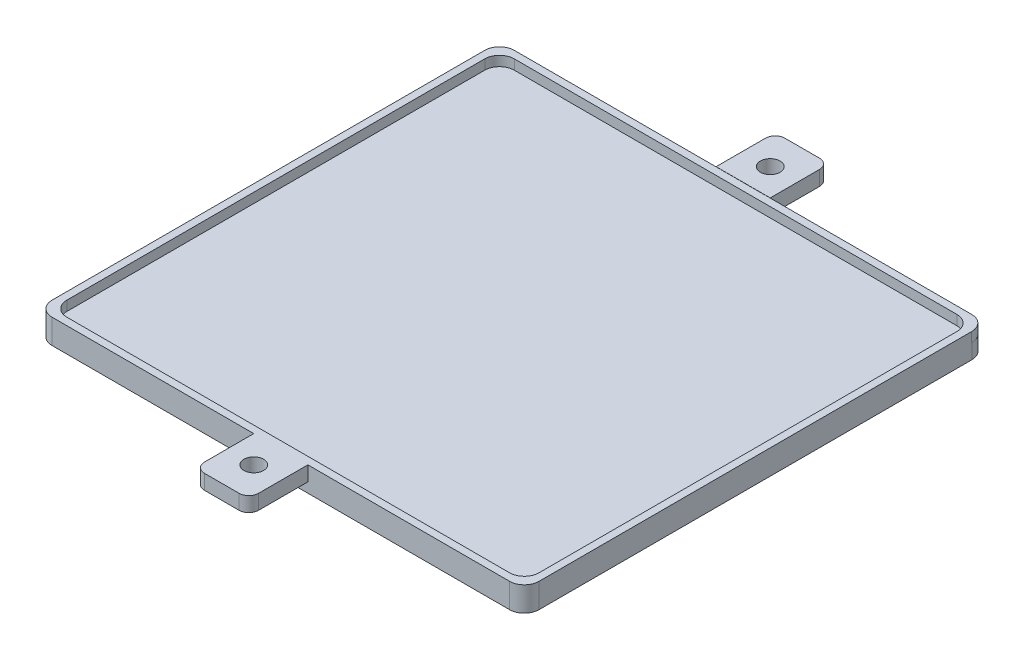
ISO-10303-21;
HEADER;
FILE_DESCRIPTION(('STEP AP214'),'2;1');
FILE_NAME('part.step','',(''),(''),'','','');
FILE_SCHEMA(('AUTOMOTIVE_DESIGN { 1 0 10303 214 1 1 1 1 }'));
ENDSEC;
DATA;
#1=APPLICATION_CONTEXT('core data for automotive mechanical design processes');
#2=APPLICATION_PROTOCOL_DEFINITION('international standard','automotive_design',2000,#1);
#3=PRODUCT_CONTEXT('',#1,'mechanical');
#4=PRODUCT('Part','Part','',(#3));
#5=PRODUCT_RELATED_PRODUCT_CATEGORY('part','',(#4));
#6=PRODUCT_DEFINITION_FORMATION('','',#4);
#7=PRODUCT_DEFINITION_CONTEXT('part definition',#1,'design');
#8=PRODUCT_DEFINITION('design','',#6,#7);
#9=PRODUCT_DEFINITION_SHAPE('','',#8);
#10=(LENGTH_UNIT() NAMED_UNIT(*) SI_UNIT(.MILLI.,.METRE.));
#11=(NAMED_UNIT(*) PLANE_ANGLE_UNIT() SI_UNIT($,.RADIAN.));
#12=(NAMED_UNIT(*) SI_UNIT($,.STERADIAN.) SOLID_ANGLE_UNIT());
#13=UNCERTAINTY_MEASURE_WITH_UNIT(LENGTH_MEASURE(1.E-05),#10,'distance_accuracy_value','');
#14=(GEOMETRIC_REPRESENTATION_CONTEXT(3) GLOBAL_UNCERTAINTY_ASSIGNED_CONTEXT((#13)) GLOBAL_UNIT_ASSIGNED_CONTEXT((#10,
#11,#12)) REPRESENTATION_CONTEXT('',''));
#15=CARTESIAN_POINT('',(0.,0.,0.));
#16=DIRECTION('',(0.,0.,1.));
#17=DIRECTION('',(1.,0.,0.));
#18=AXIS2_PLACEMENT_3D('',#15,#16,#17);
#19=CARTESIAN_POINT('',(0.,3.,0.));
#20=DIRECTION('',(0.,1.,0.));
#21=DIRECTION('',(0.,0.,1.));
#22=AXIS2_PLACEMENT_3D('',#19,#20,#21);
#23=PLANE('',#22);
#24=DIRECTION('',(-1.,0.,0.));
#25=VECTOR('',#24,1.);
#26=CARTESIAN_POINT('',(0.,3.,-90.9604451310085));
#27=LINE('',#26,#25);
#28=CARTESIAN_POINT('',(93.,3.,-90.9604451310085));
#29=VERTEX_POINT('',#28);
#30=CARTESIAN_POINT('',(0.,3.,-90.9604451310085));
#31=VERTEX_POINT('',#30);
#32=EDGE_CURVE('E61',#29,#31,#27,.T.);
#33=ORIENTED_EDGE('',*,*,#32,.F.);
#34=CARTESIAN_POINT('',(93.,3.,-87.9604451310085));
#35=DIRECTION('',(0.,1.,0.));
#36=DIRECTION('',(0.,0.,-1.));
#37=AXIS2_PLACEMENT_3D('',#34,#35,#36);
#38=CIRCLE('',#37,3.00000000000001);
#39=CARTESIAN_POINT('',(96.,3.,-87.9604451310085));
#40=VERTEX_POINT('',#39);
#41=EDGE_CURVE('E280',#40,#29,#38,.T.);
#42=ORIENTED_EDGE('',*,*,#41,.F.);
#43=DIRECTION('',(0.,0.,-1.));
#44=VECTOR('',#43,1.);
#45=CARTESIAN_POINT('',(96.,3.,0.));
#46=LINE('',#45,#44);
#47=CARTESIAN_POINT('',(96.,3.,-88.));
#48=VERTEX_POINT('',#47);
#49=EDGE_CURVE('E550',#40,#48,#46,.T.);
#50=ORIENTED_EDGE('',*,*,#49,.T.);
#51=CARTESIAN_POINT('',(93.,3.,-88.));
#52=DIRECTION('',(0.,1.,0.));
#53=DIRECTION('',(0.,0.,1.));
#54=AXIS2_PLACEMENT_3D('',#51,#52,#53);
#55=CIRCLE('',#54,3.);
#56=CARTESIAN_POINT('',(93.,3.,-91.));
#57=VERTEX_POINT('',#56);
#58=EDGE_CURVE('E553',#57,#48,#55,.F.);
#59=ORIENTED_EDGE('',*,*,#58,.F.);
#60=DIRECTION('',(1.,0.,0.));
#61=VECTOR('',#60,1.);
#62=CARTESIAN_POINT('',(0.,3.,-91.));
#63=LINE('',#62,#61);
#64=CARTESIAN_POINT('',(52.,3.,-91.));
#65=VERTEX_POINT('',#64);
#66=EDGE_CURVE('E558',#65,#57,#63,.T.);
#67=ORIENTED_EDGE('',*,*,#66,.F.);
#68=CARTESIAN_POINT('',(41.,3.,-91.));
#69=VERTEX_POINT('',#68);
#70=EDGE_CURVE('E564',#69,#65,#63,.T.);
#71=ORIENTED_EDGE('',*,*,#70,.F.);
#72=CARTESIAN_POINT('',(0.,3.,-91.));
#73=VERTEX_POINT('',#72);
#74=EDGE_CURVE('E559',#73,#69,#63,.T.);
#75=ORIENTED_EDGE('',*,*,#74,.F.);
#76=CARTESIAN_POINT('',(0.,3.,-88.));
#77=DIRECTION('',(0.,1.,0.));
#78=DIRECTION('',(0.,0.,1.));
#79=AXIS2_PLACEMENT_3D('',#76,#77,#78);
#80=CIRCLE('',#79,3.);
#81=CARTESIAN_POINT('',(-3.,3.,-88.));
#82=VERTEX_POINT('',#81);
#83=EDGE_CURVE('E563',#82,#73,#80,.F.);
#84=ORIENTED_EDGE('',*,*,#83,.F.);
#85=DIRECTION('',(0.,0.,-1.));
#86=VECTOR('',#85,1.);
#87=CARTESIAN_POINT('',(-3.,3.,0.));
#88=LINE('',#87,#86);
#89=CARTESIAN_POINT('',(-3.,3.,-87.9604451310085));
#90=VERTEX_POINT('',#89);
#91=EDGE_CURVE('E568',#90,#82,#88,.T.);
#92=ORIENTED_EDGE('',*,*,#91,.F.);
#93=CARTESIAN_POINT('',(0.,3.,-87.9604451310085));
#94=DIRECTION('',(0.,1.,0.));
#95=DIRECTION('',(0.,0.,1.));
#96=AXIS2_PLACEMENT_3D('',#93,#94,#95);
#97=CIRCLE('',#96,3.);
#98=EDGE_CURVE('E66',#31,#90,#97,.T.);
#99=ORIENTED_EDGE('',*,*,#98,.F.);
#100=EDGE_LOOP('',(#33,#42,#50,#59,#67,#71,#75,#84,#92,#99));
#101=FACE_BOUND('',#100,.T.);
#102=ADVANCED_FACE('F45',(#101),#23,.T.);
#103=CARTESIAN_POINT('',(0.,3.,3.));
#104=DIRECTION('',(0.,0.,-1.));
#105=DIRECTION('',(-1.,0.,0.));
#106=AXIS2_PLACEMENT_3D('',#103,#104,#105);
#107=PLANE('',#106);
#108=DIRECTION('',(1.,0.,0.));
#109=VECTOR('',#108,1.);
#110=CARTESIAN_POINT('',(0.,2.,3.));
#111=LINE('',#110,#109);
#112=CARTESIAN_POINT('',(41.,2.,3.));
#113=VERTEX_POINT('',#112);
#114=CARTESIAN_POINT('',(52.,2.,3.));
#115=VERTEX_POINT('',#114);
#116=EDGE_CURVE('E486',#113,#115,#111,.T.);
#117=ORIENTED_EDGE('',*,*,#116,.F.);
#118=DIRECTION('',(0.,-1.,0.));
#119=VECTOR('',#118,1.);
#120=CARTESIAN_POINT('',(41.,5.,3.));
#121=LINE('',#120,#119);
#122=CARTESIAN_POINT('',(41.,5.,3.));
#123=VERTEX_POINT('',#122);
#124=EDGE_CURVE('E503',#123,#113,#121,.T.);
#125=ORIENTED_EDGE('',*,*,#124,.F.);
#126=DIRECTION('',(1.,0.,0.));
#127=VECTOR('',#126,1.);
#128=CARTESIAN_POINT('',(0.,5.,3.));
#129=LINE('',#128,#127);
#130=CARTESIAN_POINT('',(0.,5.,3.));
#131=VERTEX_POINT('',#130);
#132=EDGE_CURVE('E359',#131,#123,#129,.T.);
#133=ORIENTED_EDGE('',*,*,#132,.F.);
#134=DIRECTION('',(0.,-1.,0.));
#135=VECTOR('',#134,1.);
#136=CARTESIAN_POINT('',(0.,3.,3.));
#137=LINE('',#136,#135);
#138=CARTESIAN_POINT('',(0.,0.,3.));
#139=VERTEX_POINT('',#138);
#140=EDGE_CURVE('E11',#131,#139,#137,.T.);
#141=ORIENTED_EDGE('',*,*,#140,.T.);
#142=DIRECTION('',(1.,0.,0.));
#143=VECTOR('',#142,1.);
#144=CARTESIAN_POINT('',(0.,0.,3.));
#145=LINE('',#144,#143);
#146=CARTESIAN_POINT('',(93.,0.,3.));
#147=VERTEX_POINT('',#146);
#148=EDGE_CURVE('E575',#139,#147,#145,.T.);
#149=ORIENTED_EDGE('',*,*,#148,.T.);
#150=DIRECTION('',(0.,-1.,0.));
#151=VECTOR('',#150,1.);
#152=CARTESIAN_POINT('',(93.,3.,3.));
#153=LINE('',#152,#151);
#154=CARTESIAN_POINT('',(93.,5.,3.));
#155=VERTEX_POINT('',#154);
#156=EDGE_CURVE('E54',#155,#147,#153,.T.);
#157=ORIENTED_EDGE('',*,*,#156,.F.);
#158=CARTESIAN_POINT('',(52.,5.,3.));
#159=VERTEX_POINT('',#158);
#160=EDGE_CURVE('E358',#159,#155,#129,.T.);
#161=ORIENTED_EDGE('',*,*,#160,.F.);
#162=DIRECTION('',(0.,-1.,0.));
#163=VECTOR('',#162,1.);
#164=CARTESIAN_POINT('',(52.,5.,3.));
#165=LINE('',#164,#163);
#166=EDGE_CURVE('E530',#159,#115,#165,.T.);
#167=ORIENTED_EDGE('',*,*,#166,.T.);
#168=EDGE_LOOP('',(#117,#125,#133,#141,#149,#157,#161,#167));
#169=FACE_BOUND('',#168,.T.);
#170=ADVANCED_FACE('F696',(#169),#107,.F.);
#171=CARTESIAN_POINT('',(0.,3.,0.));
#172=DIRECTION('',(0.,-1.,0.));
#173=DIRECTION('',(0.,0.,-1.));
#174=AXIS2_PLACEMENT_3D('',#171,#172,#173);
#175=CYLINDRICAL_SURFACE('',#174,3.);
#176=CARTESIAN_POINT('',(0.,0.,0.));
#177=DIRECTION('',(0.,1.,0.));
#178=DIRECTION('',(0.,0.,1.));
#179=AXIS2_PLACEMENT_3D('',#176,#177,#178);
#180=CIRCLE('',#179,3.);
#181=CARTESIAN_POINT('',(-3.,0.,0.));
#182=VERTEX_POINT('',#181);
#183=EDGE_CURVE('E549',#139,#182,#180,.F.);
#184=ORIENTED_EDGE('',*,*,#183,.F.);
#185=ORIENTED_EDGE('',*,*,#140,.F.);
#186=CARTESIAN_POINT('',(0.,5.,0.));
#187=DIRECTION('',(0.,1.,0.));
#188=DIRECTION('',(0.,0.,1.));
#189=AXIS2_PLACEMENT_3D('',#186,#187,#188);
#190=CIRCLE('',#189,3.);
#191=CARTESIAN_POINT('',(-3.,5.,0.));
#192=VERTEX_POINT('',#191);
#193=EDGE_CURVE('E354',#192,#131,#190,.T.);
#194=ORIENTED_EDGE('',*,*,#193,.F.);
#195=DIRECTION('',(0.,-1.,0.));
#196=VECTOR('',#195,1.);
#197=CARTESIAN_POINT('',(-3.,3.,0.));
#198=LINE('',#197,#196);
#199=EDGE_CURVE('E571',#192,#182,#198,.T.);
#200=ORIENTED_EDGE('',*,*,#199,.T.);
#201=EDGE_LOOP('',(#184,#185,#194,#200));
#202=FACE_BOUND('',#201,.T.);
#203=ADVANCED_FACE('F47',(#202),#175,.T.);
#204=CARTESIAN_POINT('',(93.,3.,0.));
#205=DIRECTION('',(0.,-1.,0.));
#206=DIRECTION('',(0.,0.,-1.));
#207=AXIS2_PLACEMENT_3D('',#204,#205,#206);
#208=CYLINDRICAL_SURFACE('',#207,3.);
#209=CARTESIAN_POINT('',(93.,0.,0.));
#210=DIRECTION('',(0.,1.,0.));
#211=DIRECTION('',(0.,0.,1.));
#212=AXIS2_PLACEMENT_3D('',#209,#210,#211);
#213=CIRCLE('',#212,3.);
#214=CARTESIAN_POINT('',(96.,0.,0.));
#215=VERTEX_POINT('',#214);
#216=EDGE_CURVE('E578',#147,#215,#213,.T.);
#217=ORIENTED_EDGE('',*,*,#216,.T.);
#218=DIRECTION('',(0.,-1.,0.));
#219=VECTOR('',#218,1.);
#220=CARTESIAN_POINT('',(96.,3.,0.));
#221=LINE('',#220,#219);
#222=CARTESIAN_POINT('',(96.,5.,0.));
#223=VERTEX_POINT('',#222);
#224=EDGE_CURVE('E614',#223,#215,#221,.T.);
#225=ORIENTED_EDGE('',*,*,#224,.F.);
#226=CARTESIAN_POINT('',(93.,5.,0.));
#227=DIRECTION('',(0.,1.,0.));
#228=DIRECTION('',(0.,0.,1.));
#229=AXIS2_PLACEMENT_3D('',#226,#227,#228);
#230=CIRCLE('',#229,3.);
#231=EDGE_CURVE('E363',#155,#223,#230,.T.);
#232=ORIENTED_EDGE('',*,*,#231,.F.);
#233=ORIENTED_EDGE('',*,*,#156,.T.);
#234=EDGE_LOOP('',(#217,#225,#232,#233));
#235=FACE_BOUND('',#234,.T.);
#236=ADVANCED_FACE('F622',(#235),#208,.T.);
#237=CARTESIAN_POINT('',(96.,3.,0.));
#238=DIRECTION('',(-1.,0.,0.));
#239=DIRECTION('',(0.,0.,1.));
#240=AXIS2_PLACEMENT_3D('',#237,#238,#239);
#241=PLANE('',#240);
#242=DIRECTION('',(0.,0.,-1.));
#243=VECTOR('',#242,1.);
#244=CARTESIAN_POINT('',(96.,0.,0.));
#245=LINE('',#244,#243);
#246=CARTESIAN_POINT('',(96.,0.,-88.));
#247=VERTEX_POINT('',#246);
#248=EDGE_CURVE('E581',#215,#247,#245,.T.);
#249=ORIENTED_EDGE('',*,*,#248,.T.);
#250=DIRECTION('',(0.,-1.,0.));
#251=VECTOR('',#250,1.);
#252=CARTESIAN_POINT('',(96.,3.,-88.));
#253=LINE('',#252,#251);
#254=EDGE_CURVE('E611',#48,#247,#253,.T.);
#255=ORIENTED_EDGE('',*,*,#254,.F.);
#256=ORIENTED_EDGE('',*,*,#49,.F.);
#257=DIRECTION('',(0.,-1.,0.));
#258=VECTOR('',#257,1.);
#259=CARTESIAN_POINT('',(96.,5.,-87.9604451310085));
#260=LINE('',#259,#258);
#261=CARTESIAN_POINT('',(96.,5.,-87.9604451310085));
#262=VERTEX_POINT('',#261);
#263=EDGE_CURVE('E401',#262,#40,#260,.T.);
#264=ORIENTED_EDGE('',*,*,#263,.F.);
#265=DIRECTION('',(0.,0.,-1.));
#266=VECTOR('',#265,1.);
#267=CARTESIAN_POINT('',(96.,5.,-87.9604451310085));
#268=LINE('',#267,#266);
#269=EDGE_CURVE('E367',#223,#262,#268,.T.);
#270=ORIENTED_EDGE('',*,*,#269,.F.);
#271=ORIENTED_EDGE('',*,*,#224,.T.);
#272=EDGE_LOOP('',(#249,#255,#256,#264,#270,#271));
#273=FACE_BOUND('',#272,.T.);
#274=ADVANCED_FACE('F634',(#273),#241,.F.);
#275=CARTESIAN_POINT('',(93.,3.,-88.));
#276=DIRECTION('',(0.,-1.,0.));
#277=DIRECTION('',(0.,0.,-1.));
#278=AXIS2_PLACEMENT_3D('',#275,#276,#277);
#279=CYLINDRICAL_SURFACE('',#278,3.);
#280=CARTESIAN_POINT('',(93.,0.,-88.));
#281=DIRECTION('',(0.,1.,0.));
#282=DIRECTION('',(0.,0.,1.));
#283=AXIS2_PLACEMENT_3D('',#280,#281,#282);
#284=CIRCLE('',#283,3.);
#285=CARTESIAN_POINT('',(93.,0.,-91.));
#286=VERTEX_POINT('',#285);
#287=EDGE_CURVE('E585',#286,#247,#284,.F.);
#288=ORIENTED_EDGE('',*,*,#287,.F.);
#289=DIRECTION('',(0.,-1.,0.));
#290=VECTOR('',#289,1.);
#291=CARTESIAN_POINT('',(93.,3.,-91.));
#292=LINE('',#291,#290);
#293=EDGE_CURVE('E608',#57,#286,#292,.T.);
#294=ORIENTED_EDGE('',*,*,#293,.F.);
#295=ORIENTED_EDGE('',*,*,#58,.T.);
#296=ORIENTED_EDGE('',*,*,#254,.T.);
#297=EDGE_LOOP('',(#288,#294,#295,#296));
#298=FACE_BOUND('',#297,.T.);
#299=ADVANCED_FACE('F1071',(#298),#279,.T.);
#300=CARTESIAN_POINT('',(0.,3.,-91.));
#301=DIRECTION('',(0.,0.,-1.));
#302=DIRECTION('',(-1.,0.,0.));
#303=AXIS2_PLACEMENT_3D('',#300,#301,#302);
#304=PLANE('',#303);
#305=DIRECTION('',(0.,-1.,0.));
#306=VECTOR('',#305,1.);
#307=CARTESIAN_POINT('',(41.,5.,-91.));
#308=LINE('',#307,#306);
#309=CARTESIAN_POINT('',(41.,2.,-91.));
#310=VERTEX_POINT('',#309);
#311=EDGE_CURVE('E472',#69,#310,#308,.T.);
#312=ORIENTED_EDGE('',*,*,#311,.T.);
#313=DIRECTION('',(1.,0.,0.));
#314=VECTOR('',#313,1.);
#315=CARTESIAN_POINT('',(0.,2.,-91.));
#316=LINE('',#315,#314);
#317=CARTESIAN_POINT('',(52.,2.,-91.));
#318=VERTEX_POINT('',#317);
#319=EDGE_CURVE('E441',#310,#318,#316,.T.);
#320=ORIENTED_EDGE('',*,*,#319,.T.);
#321=DIRECTION('',(0.,-1.,0.));
#322=VECTOR('',#321,1.);
#323=CARTESIAN_POINT('',(52.,5.,-91.));
#324=LINE('',#323,#322);
#325=EDGE_CURVE('E467',#65,#318,#324,.T.);
#326=ORIENTED_EDGE('',*,*,#325,.F.);
#327=ORIENTED_EDGE('',*,*,#66,.T.);
#328=ORIENTED_EDGE('',*,*,#293,.T.);
#329=DIRECTION('',(1.,0.,0.));
#330=VECTOR('',#329,1.);
#331=CARTESIAN_POINT('',(0.,0.,-91.));
#332=LINE('',#331,#330);
#333=CARTESIAN_POINT('',(0.,0.,-91.));
#334=VERTEX_POINT('',#333);
#335=EDGE_CURVE('E589',#334,#286,#332,.T.);
#336=ORIENTED_EDGE('',*,*,#335,.F.);
#337=DIRECTION('',(0.,-1.,0.));
#338=VECTOR('',#337,1.);
#339=CARTESIAN_POINT('',(0.,3.,-91.));
#340=LINE('',#339,#338);
#341=EDGE_CURVE('E605',#73,#334,#340,.T.);
#342=ORIENTED_EDGE('',*,*,#341,.F.);
#343=ORIENTED_EDGE('',*,*,#74,.T.);
#344=EDGE_LOOP('',(#312,#320,#326,#327,#328,#336,#342,#343));
#345=FACE_BOUND('',#344,.T.);
#346=ADVANCED_FACE('F672',(#345),#304,.T.);
#347=CARTESIAN_POINT('',(0.,3.,-88.));
#348=DIRECTION('',(0.,-1.,0.));
#349=DIRECTION('',(0.,0.,-1.));
#350=AXIS2_PLACEMENT_3D('',#347,#348,#349);
#351=CYLINDRICAL_SURFACE('',#350,3.);
#352=CARTESIAN_POINT('',(0.,0.,-88.));
#353=DIRECTION('',(0.,1.,0.));
#354=DIRECTION('',(0.,0.,1.));
#355=AXIS2_PLACEMENT_3D('',#352,#353,#354);
#356=CIRCLE('',#355,3.);
#357=CARTESIAN_POINT('',(-3.,0.,-88.));
#358=VERTEX_POINT('',#357);
#359=EDGE_CURVE('E593',#358,#334,#356,.F.);
#360=ORIENTED_EDGE('',*,*,#359,.F.);
#361=DIRECTION('',(0.,-1.,0.));
#362=VECTOR('',#361,1.);
#363=CARTESIAN_POINT('',(-3.,3.,-88.));
#364=LINE('',#363,#362);
#365=EDGE_CURVE('E602',#82,#358,#364,.T.);
#366=ORIENTED_EDGE('',*,*,#365,.F.);
#367=ORIENTED_EDGE('',*,*,#83,.T.);
#368=ORIENTED_EDGE('',*,*,#341,.T.);
#369=EDGE_LOOP('',(#360,#366,#367,#368));
#370=FACE_BOUND('',#369,.T.);
#371=ADVANCED_FACE('F1080',(#370),#351,.T.);
#372=CARTESIAN_POINT('',(-3.,3.,0.));
#373=DIRECTION('',(-1.,0.,0.));
#374=DIRECTION('',(0.,0.,1.));
#375=AXIS2_PLACEMENT_3D('',#372,#373,#374);
#376=PLANE('',#375);
#377=DIRECTION('',(0.,0.,-1.));
#378=VECTOR('',#377,1.);
#379=CARTESIAN_POINT('',(-3.,0.,0.));
#380=LINE('',#379,#378);
#381=EDGE_CURVE('E554',#182,#358,#380,.T.);
#382=ORIENTED_EDGE('',*,*,#381,.F.);
#383=ORIENTED_EDGE('',*,*,#199,.F.);
#384=DIRECTION('',(0.,0.,1.));
#385=VECTOR('',#384,1.);
#386=CARTESIAN_POINT('',(-3.,5.,-87.9604451310085));
#387=LINE('',#386,#385);
#388=CARTESIAN_POINT('',(-3.,5.,-87.9604451310085));
#389=VERTEX_POINT('',#388);
#390=EDGE_CURVE('E379',#389,#192,#387,.T.);
#391=ORIENTED_EDGE('',*,*,#390,.F.);
#392=DIRECTION('',(0.,-1.,0.));
#393=VECTOR('',#392,1.);
#394=CARTESIAN_POINT('',(-3.,5.,-87.9604451310085));
#395=LINE('',#394,#393);
#396=EDGE_CURVE('E383',#389,#90,#395,.T.);
#397=ORIENTED_EDGE('',*,*,#396,.T.);
#398=ORIENTED_EDGE('',*,*,#91,.T.);
#399=ORIENTED_EDGE('',*,*,#365,.T.);
#400=EDGE_LOOP('',(#382,#383,#391,#397,#398,#399));
#401=FACE_BOUND('',#400,.T.);
#402=ADVANCED_FACE('F883',(#401),#376,.T.);
#403=CARTESIAN_POINT('',(0.,0.,0.));
#404=DIRECTION('',(0.,1.,0.));
#405=DIRECTION('',(0.,0.,1.));
#406=AXIS2_PLACEMENT_3D('',#403,#404,#405);
#407=PLANE('',#406);
#408=ORIENTED_EDGE('',*,*,#183,.T.);
#409=ORIENTED_EDGE('',*,*,#381,.T.);
#410=ORIENTED_EDGE('',*,*,#359,.T.);
#411=ORIENTED_EDGE('',*,*,#335,.T.);
#412=ORIENTED_EDGE('',*,*,#287,.T.);
#413=ORIENTED_EDGE('',*,*,#248,.F.);
#414=ORIENTED_EDGE('',*,*,#216,.F.);
#415=ORIENTED_EDGE('',*,*,#148,.F.);
#416=EDGE_LOOP('',(#408,#409,#410,#411,#412,#413,#414,#415));
#417=FACE_BOUND('',#416,.T.);
#418=ADVANCED_FACE('F629',(#417),#407,.F.);
#419=CARTESIAN_POINT('',(41.,5.,0.));
#420=DIRECTION('',(1.,0.,0.));
#421=DIRECTION('',(0.,0.,-1.));
#422=AXIS2_PLACEMENT_3D('',#419,#420,#421);
#423=PLANE('',#422);
#424=DIRECTION('',(0.,0.,1.));
#425=VECTOR('',#424,1.);
#426=CARTESIAN_POINT('',(41.,2.,0.));
#427=LINE('',#426,#425);
#428=CARTESIAN_POINT('',(41.,2.,13.));
#429=VERTEX_POINT('',#428);
#430=EDGE_CURVE('E507',#113,#429,#427,.T.);
#431=ORIENTED_EDGE('',*,*,#430,.T.);
#432=DIRECTION('',(0.,-1.,0.));
#433=VECTOR('',#432,1.);
#434=CARTESIAN_POINT('',(41.,5.,13.));
#435=LINE('',#434,#433);
#436=CARTESIAN_POINT('',(41.,5.,13.));
#437=VERTEX_POINT('',#436);
#438=EDGE_CURVE('E545',#437,#429,#435,.T.);
#439=ORIENTED_EDGE('',*,*,#438,.F.);
#440=DIRECTION('',(0.,0.,1.));
#441=VECTOR('',#440,1.);
#442=CARTESIAN_POINT('',(41.,5.,0.));
#443=LINE('',#442,#441);
#444=EDGE_CURVE('E485',#123,#437,#443,.T.);
#445=ORIENTED_EDGE('',*,*,#444,.F.);
#446=ORIENTED_EDGE('',*,*,#124,.T.);
#447=EDGE_LOOP('',(#431,#439,#445,#446));
#448=FACE_BOUND('',#447,.T.);
#449=ADVANCED_FACE('F893',(#448),#423,.F.);
#450=CARTESIAN_POINT('',(43.,5.,13.));
#451=DIRECTION('',(0.,-1.,0.));
#452=DIRECTION('',(0.,0.,-1.));
#453=AXIS2_PLACEMENT_3D('',#450,#451,#452);
#454=CYLINDRICAL_SURFACE('',#453,2.);
#455=CARTESIAN_POINT('',(43.,2.,13.));
#456=DIRECTION('',(0.,1.,0.));
#457=DIRECTION('',(0.,0.,1.));
#458=AXIS2_PLACEMENT_3D('',#455,#456,#457);
#459=CIRCLE('',#458,2.);
#460=CARTESIAN_POINT('',(43.,2.,15.));
#461=VERTEX_POINT('',#460);
#462=EDGE_CURVE('E511',#429,#461,#459,.T.);
#463=ORIENTED_EDGE('',*,*,#462,.T.);
#464=DIRECTION('',(0.,-1.,0.));
#465=VECTOR('',#464,1.);
#466=CARTESIAN_POINT('',(43.,5.,15.));
#467=LINE('',#466,#465);
#468=CARTESIAN_POINT('',(43.,5.,15.));
#469=VERTEX_POINT('',#468);
#470=EDGE_CURVE('E541',#469,#461,#467,.T.);
#471=ORIENTED_EDGE('',*,*,#470,.F.);
#472=CARTESIAN_POINT('',(43.,5.,13.));
#473=DIRECTION('',(0.,1.,0.));
#474=DIRECTION('',(0.,0.,1.));
#475=AXIS2_PLACEMENT_3D('',#472,#473,#474);
#476=CIRCLE('',#475,2.);
#477=EDGE_CURVE('E490',#437,#469,#476,.T.);
#478=ORIENTED_EDGE('',*,*,#477,.F.);
#479=ORIENTED_EDGE('',*,*,#438,.T.);
#480=EDGE_LOOP('',(#463,#471,#478,#479));
#481=FACE_BOUND('',#480,.T.);
#482=ADVANCED_FACE('F913',(#481),#454,.T.);
#483=CARTESIAN_POINT('',(0.,5.,15.));
#484=DIRECTION('',(0.,0.,-1.));
#485=DIRECTION('',(-1.,0.,0.));
#486=AXIS2_PLACEMENT_3D('',#483,#484,#485);
#487=PLANE('',#486);
#488=DIRECTION('',(1.,0.,0.));
#489=VECTOR('',#488,1.);
#490=CARTESIAN_POINT('',(0.,2.,15.));
#491=LINE('',#490,#489);
#492=CARTESIAN_POINT('',(50.,2.,15.));
#493=VERTEX_POINT('',#492);
#494=EDGE_CURVE('E514',#461,#493,#491,.T.);
#495=ORIENTED_EDGE('',*,*,#494,.T.);
#496=DIRECTION('',(0.,-1.,0.));
#497=VECTOR('',#496,1.);
#498=CARTESIAN_POINT('',(50.,5.,15.));
#499=LINE('',#498,#497);
#500=CARTESIAN_POINT('',(50.,5.,15.));
#501=VERTEX_POINT('',#500);
#502=EDGE_CURVE('E537',#501,#493,#499,.T.);
#503=ORIENTED_EDGE('',*,*,#502,.F.);
#504=DIRECTION('',(1.,0.,0.));
#505=VECTOR('',#504,1.);
#506=CARTESIAN_POINT('',(0.,5.,15.));
#507=LINE('',#506,#505);
#508=EDGE_CURVE('E493',#469,#501,#507,.T.);
#509=ORIENTED_EDGE('',*,*,#508,.F.);
#510=ORIENTED_EDGE('',*,*,#470,.T.);
#511=EDGE_LOOP('',(#495,#503,#509,#510));
#512=FACE_BOUND('',#511,.T.);
#513=ADVANCED_FACE('F926',(#512),#487,.F.);
#514=CARTESIAN_POINT('',(50.,5.,13.));
#515=DIRECTION('',(0.,-1.,0.));
#516=DIRECTION('',(0.,0.,-1.));
#517=AXIS2_PLACEMENT_3D('',#514,#515,#516);
#518=CYLINDRICAL_SURFACE('',#517,2.);
#519=CARTESIAN_POINT('',(50.,2.,13.));
#520=DIRECTION('',(0.,1.,0.));
#521=DIRECTION('',(0.,0.,1.));
#522=AXIS2_PLACEMENT_3D('',#519,#520,#521);
#523=CIRCLE('',#522,2.);
#524=CARTESIAN_POINT('',(52.,2.,13.));
#525=VERTEX_POINT('',#524);
#526=EDGE_CURVE('E517',#493,#525,#523,.T.);
#527=ORIENTED_EDGE('',*,*,#526,.T.);
#528=DIRECTION('',(0.,-1.,0.));
#529=VECTOR('',#528,1.);
#530=CARTESIAN_POINT('',(52.,5.,13.));
#531=LINE('',#530,#529);
#532=CARTESIAN_POINT('',(52.,5.,13.));
#533=VERTEX_POINT('',#532);
#534=EDGE_CURVE('E534',#533,#525,#531,.T.);
#535=ORIENTED_EDGE('',*,*,#534,.F.);
#536=CARTESIAN_POINT('',(50.,5.,13.));
#537=DIRECTION('',(0.,1.,0.));
#538=DIRECTION('',(0.,0.,1.));
#539=AXIS2_PLACEMENT_3D('',#536,#537,#538);
#540=CIRCLE('',#539,2.);
#541=EDGE_CURVE('E496',#501,#533,#540,.T.);
#542=ORIENTED_EDGE('',*,*,#541,.F.);
#543=ORIENTED_EDGE('',*,*,#502,.T.);
#544=EDGE_LOOP('',(#527,#535,#542,#543));
#545=FACE_BOUND('',#544,.T.);
#546=ADVANCED_FACE('F937',(#545),#518,.T.);
#547=CARTESIAN_POINT('',(52.,5.,0.));
#548=DIRECTION('',(1.,0.,0.));
#549=DIRECTION('',(0.,0.,-1.));
#550=AXIS2_PLACEMENT_3D('',#547,#548,#549);
#551=PLANE('',#550);
#552=DIRECTION('',(0.,0.,1.));
#553=VECTOR('',#552,1.);
#554=CARTESIAN_POINT('',(52.,2.,0.));
#555=LINE('',#554,#553);
#556=EDGE_CURVE('E521',#115,#525,#555,.T.);
#557=ORIENTED_EDGE('',*,*,#556,.F.);
#558=ORIENTED_EDGE('',*,*,#166,.F.);
#559=DIRECTION('',(0.,0.,1.));
#560=VECTOR('',#559,1.);
#561=CARTESIAN_POINT('',(52.,5.,0.));
#562=LINE('',#561,#560);
#563=EDGE_CURVE('E499',#159,#533,#562,.T.);
#564=ORIENTED_EDGE('',*,*,#563,.T.);
#565=ORIENTED_EDGE('',*,*,#534,.T.);
#566=EDGE_LOOP('',(#557,#558,#564,#565));
#567=FACE_BOUND('',#566,.T.);
#568=ADVANCED_FACE('F948',(#567),#551,.T.);
#569=CARTESIAN_POINT('',(46.5,5.,8.5));
#570=DIRECTION('',(0.,-1.,0.));
#571=DIRECTION('',(0.,0.,-1.));
#572=AXIS2_PLACEMENT_3D('',#569,#570,#571);
#573=CYLINDRICAL_SURFACE('',#572,2.);
#574=CARTESIAN_POINT('',(46.5,5.,8.5));
#575=DIRECTION('',(0.,1.,0.));
#576=DIRECTION('',(0.,0.,1.));
#577=AXIS2_PLACEMENT_3D('',#574,#575,#576);
#578=CIRCLE('',#577,2.);
#579=CARTESIAN_POINT('',(46.5,5.,10.5));
#580=VERTEX_POINT('',#579);
#581=EDGE_CURVE('E481',#580,#580,#578,.T.);
#582=ORIENTED_EDGE('',*,*,#581,.T.);
#583=EDGE_LOOP('',(#582));
#584=FACE_BOUND('',#583,.T.);
#585=CARTESIAN_POINT('',(46.5,2.,8.5));
#586=DIRECTION('',(0.,1.,0.));
#587=DIRECTION('',(0.,0.,1.));
#588=AXIS2_PLACEMENT_3D('',#585,#586,#587);
#589=CIRCLE('',#588,2.);
#590=CARTESIAN_POINT('',(46.5,2.,10.5));
#591=VERTEX_POINT('',#590);
#592=EDGE_CURVE('E480',#591,#591,#589,.T.);
#593=ORIENTED_EDGE('',*,*,#592,.F.);
#594=EDGE_LOOP('',(#593));
#595=FACE_BOUND('',#594,.T.);
#596=ADVANCED_FACE('F959',(#584,#595),#573,.F.);
#597=CARTESIAN_POINT('',(0.,5.,0.));
#598=DIRECTION('',(0.,1.,0.));
#599=DIRECTION('',(0.,0.,1.));
#600=AXIS2_PLACEMENT_3D('',#597,#598,#599);
#601=PLANE('',#600);
#602=ORIENTED_EDGE('',*,*,#581,.F.);
#603=EDGE_LOOP('',(#602));
#604=FACE_BOUND('',#603,.T.);
#605=ORIENTED_EDGE('',*,*,#444,.T.);
#606=ORIENTED_EDGE('',*,*,#477,.T.);
#607=ORIENTED_EDGE('',*,*,#508,.T.);
#608=ORIENTED_EDGE('',*,*,#541,.T.);
#609=ORIENTED_EDGE('',*,*,#563,.F.);
#610=ORIENTED_EDGE('',*,*,#160,.T.);
#611=ORIENTED_EDGE('',*,*,#231,.T.);
#612=ORIENTED_EDGE('',*,*,#269,.T.);
#613=CARTESIAN_POINT('',(93.,5.,-87.9604451310085));
#614=DIRECTION('',(0.,1.,0.));
#615=DIRECTION('',(0.,0.,-1.));
#616=AXIS2_PLACEMENT_3D('',#613,#614,#615);
#617=CIRCLE('',#616,3.00000000000001);
#618=CARTESIAN_POINT('',(93.,5.,-90.9604451310085));
#619=VERTEX_POINT('',#618);
#620=EDGE_CURVE('E370',#262,#619,#617,.T.);
#621=ORIENTED_EDGE('',*,*,#620,.T.);
#622=DIRECTION('',(-1.,0.,0.));
#623=VECTOR('',#622,1.);
#624=CARTESIAN_POINT('',(0.,5.,-90.9604451310085));
#625=LINE('',#624,#623);
#626=CARTESIAN_POINT('',(0.,5.,-90.9604451310085));
#627=VERTEX_POINT('',#626);
#628=EDGE_CURVE('E373',#619,#627,#625,.T.);
#629=ORIENTED_EDGE('',*,*,#628,.T.);
#630=CARTESIAN_POINT('',(0.,5.,-87.9604451310085));
#631=DIRECTION('',(0.,1.,0.));
#632=DIRECTION('',(0.,0.,1.));
#633=AXIS2_PLACEMENT_3D('',#630,#631,#632);
#634=CIRCLE('',#633,3.);
#635=EDGE_CURVE('E376',#627,#389,#634,.T.);
#636=ORIENTED_EDGE('',*,*,#635,.T.);
#637=ORIENTED_EDGE('',*,*,#390,.T.);
#638=ORIENTED_EDGE('',*,*,#193,.T.);
#639=ORIENTED_EDGE('',*,*,#132,.T.);
#640=EDGE_LOOP('',(#605,#606,#607,#608,#609,#610,#611,#612,#621,#629,#636,#637,#638,#639));
#641=FACE_BOUND('',#640,.T.);
#642=DIRECTION('',(-1.,0.,0.));
#643=VECTOR('',#642,1.);
#644=CARTESIAN_POINT('',(1.5,5.,-89.4604451310085));
#645=LINE('',#644,#643);
#646=CARTESIAN_POINT('',(91.5,5.,-89.4604451310085));
#647=VERTEX_POINT('',#646);
#648=CARTESIAN_POINT('',(1.5,5.,-89.4604451310085));
#649=VERTEX_POINT('',#648);
#650=EDGE_CURVE('E270',#647,#649,#645,.T.);
#651=ORIENTED_EDGE('',*,*,#650,.F.);
#652=CARTESIAN_POINT('',(91.5,5.,-86.4604451310085));
#653=DIRECTION('',(0.,1.,0.));
#654=DIRECTION('',(0.,0.,-1.));
#655=AXIS2_PLACEMENT_3D('',#652,#653,#654);
#656=CIRCLE('',#655,3.);
#657=CARTESIAN_POINT('',(94.5,5.,-86.4604451310085));
#658=VERTEX_POINT('',#657);
#659=EDGE_CURVE('E259',#658,#647,#656,.T.);
#660=ORIENTED_EDGE('',*,*,#659,.F.);
#661=DIRECTION('',(0.,0.,-1.));
#662=VECTOR('',#661,1.);
#663=CARTESIAN_POINT('',(94.5,5.,-86.4604451310085));
#664=LINE('',#663,#662);
#665=CARTESIAN_POINT('',(94.5,5.,-1.5));
#666=VERTEX_POINT('',#665);
#667=EDGE_CURVE('E305',#666,#658,#664,.T.);
#668=ORIENTED_EDGE('',*,*,#667,.F.);
#669=CARTESIAN_POINT('',(91.5,5.,-1.5));
#670=DIRECTION('',(0.,1.,0.));
#671=DIRECTION('',(0.,0.,1.));
#672=AXIS2_PLACEMENT_3D('',#669,#670,#671);
#673=CIRCLE('',#672,3.00000000000001);
#674=CARTESIAN_POINT('',(91.5,5.,1.5));
#675=VERTEX_POINT('',#674);
#676=EDGE_CURVE('E301',#675,#666,#673,.T.);
#677=ORIENTED_EDGE('',*,*,#676,.F.);
#678=DIRECTION('',(1.,0.,0.));
#679=VECTOR('',#678,1.);
#680=CARTESIAN_POINT('',(1.50000000000001,5.,1.5));
#681=LINE('',#680,#679);
#682=CARTESIAN_POINT('',(1.50000000000001,5.,1.5));
#683=VERTEX_POINT('',#682);
#684=EDGE_CURVE('E298',#683,#675,#681,.T.);
#685=ORIENTED_EDGE('',*,*,#684,.F.);
#686=CARTESIAN_POINT('',(1.50000000000001,5.,-1.5));
#687=DIRECTION('',(0.,1.,0.));
#688=DIRECTION('',(0.,0.,1.));
#689=AXIS2_PLACEMENT_3D('',#686,#687,#688);
#690=CIRCLE('',#689,3.);
#691=CARTESIAN_POINT('',(-1.49999999999999,5.,-1.5));
#692=VERTEX_POINT('',#691);
#693=EDGE_CURVE('E295',#692,#683,#690,.T.);
#694=ORIENTED_EDGE('',*,*,#693,.F.);
#695=DIRECTION('',(0.,0.,1.));
#696=VECTOR('',#695,1.);
#697=CARTESIAN_POINT('',(-1.5,5.,-86.4604451310085));
#698=LINE('',#697,#696);
#699=CARTESIAN_POINT('',(-1.5,5.,-86.4604451310085));
#700=VERTEX_POINT('',#699);
#701=EDGE_CURVE('E290',#700,#692,#698,.T.);
#702=ORIENTED_EDGE('',*,*,#701,.F.);
#703=CARTESIAN_POINT('',(1.5,5.,-86.4604451310085));
#704=DIRECTION('',(0.,1.,0.));
#705=DIRECTION('',(0.,0.,1.));
#706=AXIS2_PLACEMENT_3D('',#703,#704,#705);
#707=CIRCLE('',#706,3.);
#708=EDGE_CURVE('E286',#649,#700,#707,.T.);
#709=ORIENTED_EDGE('',*,*,#708,.F.);
#710=EDGE_LOOP('',(#651,#660,#668,#677,#685,#694,#702,#709));
#711=FACE_BOUND('',#710,.T.);
#712=ADVANCED_FACE('F284',(#604,#641,#711),#601,.T.);
#713=CARTESIAN_POINT('',(0.,2.,0.));
#714=DIRECTION('',(0.,1.,0.));
#715=DIRECTION('',(0.,0.,1.));
#716=AXIS2_PLACEMENT_3D('',#713,#714,#715);
#717=PLANE('',#716);
#718=ORIENTED_EDGE('',*,*,#592,.T.);
#719=EDGE_LOOP('',(#718));
#720=FACE_BOUND('',#719,.T.);
#721=ORIENTED_EDGE('',*,*,#430,.F.);
#722=ORIENTED_EDGE('',*,*,#116,.T.);
#723=ORIENTED_EDGE('',*,*,#556,.T.);
#724=ORIENTED_EDGE('',*,*,#526,.F.);
#725=ORIENTED_EDGE('',*,*,#494,.F.);
#726=ORIENTED_EDGE('',*,*,#462,.F.);
#727=EDGE_LOOP('',(#721,#722,#723,#724,#725,#726));
#728=FACE_BOUND('',#727,.T.);
#729=ADVANCED_FACE('F685',(#720,#728),#717,.F.);
#730=CARTESIAN_POINT('',(43.,5.,-101.));
#731=DIRECTION('',(0.,-1.,0.));
#732=DIRECTION('',(0.,0.,-1.));
#733=AXIS2_PLACEMENT_3D('',#730,#731,#732);
#734=CYLINDRICAL_SURFACE('',#733,1.99999999999999);
#735=CARTESIAN_POINT('',(43.,2.,-101.));
#736=DIRECTION('',(0.,1.,0.));
#737=DIRECTION('',(0.,0.,1.));
#738=AXIS2_PLACEMENT_3D('',#735,#736,#737);
#739=CIRCLE('',#738,1.99999999999999);
#740=CARTESIAN_POINT('',(41.,2.,-101.));
#741=VERTEX_POINT('',#740);
#742=CARTESIAN_POINT('',(43.,2.,-103.));
#743=VERTEX_POINT('',#742);
#744=EDGE_CURVE('E405',#741,#743,#739,.F.);
#745=ORIENTED_EDGE('',*,*,#744,.F.);
#746=DIRECTION('',(0.,-1.,0.));
#747=VECTOR('',#746,1.);
#748=CARTESIAN_POINT('',(41.,5.,-101.));
#749=LINE('',#748,#747);
#750=CARTESIAN_POINT('',(41.,5.,-101.));
#751=VERTEX_POINT('',#750);
#752=EDGE_CURVE('E477',#751,#741,#749,.T.);
#753=ORIENTED_EDGE('',*,*,#752,.F.);
#754=CARTESIAN_POINT('',(43.,5.,-101.));
#755=DIRECTION('',(0.,1.,0.));
#756=DIRECTION('',(0.,0.,1.));
#757=AXIS2_PLACEMENT_3D('',#754,#755,#756);
#758=CIRCLE('',#757,1.99999999999999);
#759=CARTESIAN_POINT('',(43.,5.,-103.));
#760=VERTEX_POINT('',#759);
#761=EDGE_CURVE('E406',#751,#760,#758,.F.);
#762=ORIENTED_EDGE('',*,*,#761,.T.);
#763=DIRECTION('',(0.,-1.,0.));
#764=VECTOR('',#763,1.);
#765=CARTESIAN_POINT('',(43.,5.,-103.));
#766=LINE('',#765,#764);
#767=EDGE_CURVE('E433',#760,#743,#766,.T.);
#768=ORIENTED_EDGE('',*,*,#767,.T.);
#769=EDGE_LOOP('',(#745,#753,#762,#768));
#770=FACE_BOUND('',#769,.T.);
#771=ADVANCED_FACE('F683',(#770),#734,.T.);
#772=CARTESIAN_POINT('',(40.9999999999997,5.,1.42247325030097E-13));
#773=DIRECTION('',(-1.,0.,0.));
#774=DIRECTION('',(0.,0.,1.));
#775=AXIS2_PLACEMENT_3D('',#772,#773,#774);
#776=PLANE('',#775);
#777=DIRECTION('',(0.,0.,-1.));
#778=VECTOR('',#777,1.);
#779=CARTESIAN_POINT('',(40.9999999999997,2.,1.42247325030097E-13));
#780=LINE('',#779,#778);
#781=EDGE_CURVE('E437',#310,#741,#780,.T.);
#782=ORIENTED_EDGE('',*,*,#781,.F.);
#783=ORIENTED_EDGE('',*,*,#311,.F.);
#784=CARTESIAN_POINT('',(41.,5.,-91.));
#785=VERTEX_POINT('',#784);
#786=EDGE_CURVE('E473',#785,#69,#308,.T.);
#787=ORIENTED_EDGE('',*,*,#786,.F.);
#788=DIRECTION('',(0.,0.,-1.));
#789=VECTOR('',#788,1.);
#790=CARTESIAN_POINT('',(40.9999999999997,5.,1.42247325030097E-13));
#791=LINE('',#790,#789);
#792=EDGE_CURVE('E410',#785,#751,#791,.T.);
#793=ORIENTED_EDGE('',*,*,#792,.T.);
#794=ORIENTED_EDGE('',*,*,#752,.T.);
#795=EDGE_LOOP('',(#782,#783,#787,#793,#794));
#796=FACE_BOUND('',#795,.T.);
#797=ADVANCED_FACE('F667',(#796),#776,.T.);
#798=CARTESIAN_POINT('',(0.,5.,-91.));
#799=DIRECTION('',(0.,0.,-1.));
#800=DIRECTION('',(-1.,0.,0.));
#801=AXIS2_PLACEMENT_3D('',#798,#799,#800);
#802=PLANE('',#801);
#803=ORIENTED_EDGE('',*,*,#70,.T.);
#804=CARTESIAN_POINT('',(52.,5.,-91.));
#805=VERTEX_POINT('',#804);
#806=EDGE_CURVE('E468',#805,#65,#324,.T.);
#807=ORIENTED_EDGE('',*,*,#806,.F.);
#808=DIRECTION('',(1.,0.,0.));
#809=VECTOR('',#808,1.);
#810=CARTESIAN_POINT('',(0.,5.,-91.));
#811=LINE('',#810,#809);
#812=EDGE_CURVE('E415',#785,#805,#811,.T.);
#813=ORIENTED_EDGE('',*,*,#812,.F.);
#814=ORIENTED_EDGE('',*,*,#786,.T.);
#815=EDGE_LOOP('',(#803,#807,#813,#814));
#816=FACE_BOUND('',#815,.T.);
#817=ADVANCED_FACE('F649',(#816),#802,.F.);
#818=CARTESIAN_POINT('',(51.9999999999997,5.,1.80411241501587E-13));
#819=DIRECTION('',(-1.,0.,0.));
#820=DIRECTION('',(0.,0.,1.));
#821=AXIS2_PLACEMENT_3D('',#818,#819,#820);
#822=PLANE('',#821);
#823=DIRECTION('',(0.,0.,-1.));
#824=VECTOR('',#823,1.);
#825=CARTESIAN_POINT('',(51.9999999999997,2.,1.80411241501587E-13));
#826=LINE('',#825,#824);
#827=CARTESIAN_POINT('',(52.,2.,-101.));
#828=VERTEX_POINT('',#827);
#829=EDGE_CURVE('E444',#318,#828,#826,.T.);
#830=ORIENTED_EDGE('',*,*,#829,.T.);
#831=DIRECTION('',(0.,-1.,0.));
#832=VECTOR('',#831,1.);
#833=CARTESIAN_POINT('',(52.,5.,-101.));
#834=LINE('',#833,#832);
#835=CARTESIAN_POINT('',(52.,5.,-101.));
#836=VERTEX_POINT('',#835);
#837=EDGE_CURVE('E464',#836,#828,#834,.T.);
#838=ORIENTED_EDGE('',*,*,#837,.F.);
#839=DIRECTION('',(0.,0.,-1.));
#840=VECTOR('',#839,1.);
#841=CARTESIAN_POINT('',(51.9999999999997,5.,1.80411241501587E-13));
#842=LINE('',#841,#840);
#843=EDGE_CURVE('E418',#805,#836,#842,.T.);
#844=ORIENTED_EDGE('',*,*,#843,.F.);
#845=ORIENTED_EDGE('',*,*,#806,.T.);
#846=ORIENTED_EDGE('',*,*,#325,.T.);
#847=EDGE_LOOP('',(#830,#838,#844,#845,#846));
#848=FACE_BOUND('',#847,.T.);
#849=ADVANCED_FACE('F654',(#848),#822,.F.);
#850=CARTESIAN_POINT('',(50.,5.,-101.));
#851=DIRECTION('',(0.,-1.,0.));
#852=DIRECTION('',(0.,0.,-1.));
#853=AXIS2_PLACEMENT_3D('',#850,#851,#852);
#854=CYLINDRICAL_SURFACE('',#853,1.99999999999999);
#855=CARTESIAN_POINT('',(50.,2.,-101.));
#856=DIRECTION('',(0.,1.,0.));
#857=DIRECTION('',(0.,0.,1.));
#858=AXIS2_PLACEMENT_3D('',#855,#856,#857);
#859=CIRCLE('',#858,1.99999999999999);
#860=CARTESIAN_POINT('',(50.,2.,-103.));
#861=VERTEX_POINT('',#860);
#862=EDGE_CURVE('E448',#861,#828,#859,.F.);
#863=ORIENTED_EDGE('',*,*,#862,.F.);
#864=DIRECTION('',(0.,-1.,0.));
#865=VECTOR('',#864,1.);
#866=CARTESIAN_POINT('',(50.,5.,-103.));
#867=LINE('',#866,#865);
#868=CARTESIAN_POINT('',(50.,5.,-103.));
#869=VERTEX_POINT('',#868);
#870=EDGE_CURVE('E461',#869,#861,#867,.T.);
#871=ORIENTED_EDGE('',*,*,#870,.F.);
#872=CARTESIAN_POINT('',(50.,5.,-101.));
#873=DIRECTION('',(0.,1.,0.));
#874=DIRECTION('',(0.,0.,1.));
#875=AXIS2_PLACEMENT_3D('',#872,#873,#874);
#876=CIRCLE('',#875,1.99999999999999);
#877=EDGE_CURVE('E421',#869,#836,#876,.F.);
#878=ORIENTED_EDGE('',*,*,#877,.T.);
#879=ORIENTED_EDGE('',*,*,#837,.T.);
#880=EDGE_LOOP('',(#863,#871,#878,#879));
#881=FACE_BOUND('',#880,.T.);
#882=ADVANCED_FACE('F679',(#881),#854,.T.);
#883=CARTESIAN_POINT('',(0.,5.,-103.));
#884=DIRECTION('',(0.,0.,-1.));
#885=DIRECTION('',(-1.,0.,0.));
#886=AXIS2_PLACEMENT_3D('',#883,#884,#885);
#887=PLANE('',#886);
#888=DIRECTION('',(1.,0.,0.));
#889=VECTOR('',#888,1.);
#890=CARTESIAN_POINT('',(0.,2.,-103.));
#891=LINE('',#890,#889);
#892=EDGE_CURVE('E452',#743,#861,#891,.T.);
#893=ORIENTED_EDGE('',*,*,#892,.F.);
#894=ORIENTED_EDGE('',*,*,#767,.F.);
#895=DIRECTION('',(1.,0.,0.));
#896=VECTOR('',#895,1.);
#897=CARTESIAN_POINT('',(0.,5.,-103.));
#898=LINE('',#897,#896);
#899=EDGE_CURVE('E425',#760,#869,#898,.T.);
#900=ORIENTED_EDGE('',*,*,#899,.T.);
#901=ORIENTED_EDGE('',*,*,#870,.T.);
#902=EDGE_LOOP('',(#893,#894,#900,#901));
#903=FACE_BOUND('',#902,.T.);
#904=ADVANCED_FACE('F681',(#903),#887,.T.);
#905=CARTESIAN_POINT('',(46.5,5.,-96.5));
#906=DIRECTION('',(0.,-1.,0.));
#907=DIRECTION('',(0.,0.,-1.));
#908=AXIS2_PLACEMENT_3D('',#905,#906,#907);
#909=CYLINDRICAL_SURFACE('',#908,2.00000000000001);
#910=CARTESIAN_POINT('',(46.5,5.,-96.5));
#911=DIRECTION('',(0.,1.,0.));
#912=DIRECTION('',(0.,0.,1.));
#913=AXIS2_PLACEMENT_3D('',#910,#911,#912);
#914=CIRCLE('',#913,2.00000000000001);
#915=CARTESIAN_POINT('',(46.5,5.,-94.5));
#916=VERTEX_POINT('',#915);
#917=EDGE_CURVE('E429',#916,#916,#914,.F.);
#918=ORIENTED_EDGE('',*,*,#917,.F.);
#919=EDGE_LOOP('',(#918));
#920=FACE_BOUND('',#919,.T.);
#921=CARTESIAN_POINT('',(46.5,2.,-96.5));
#922=DIRECTION('',(0.,1.,0.));
#923=DIRECTION('',(0.,0.,1.));
#924=AXIS2_PLACEMENT_3D('',#921,#922,#923);
#925=CIRCLE('',#924,2.00000000000001);
#926=CARTESIAN_POINT('',(46.5,2.,-94.5));
#927=VERTEX_POINT('',#926);
#928=EDGE_CURVE('E411',#927,#927,#925,.F.);
#929=ORIENTED_EDGE('',*,*,#928,.T.);
#930=EDGE_LOOP('',(#929));
#931=FACE_BOUND('',#930,.T.);
#932=ADVANCED_FACE('F761',(#920,#931),#909,.F.);
#933=CARTESIAN_POINT('',(0.,5.,0.));
#934=DIRECTION('',(0.,1.,0.));
#935=DIRECTION('',(0.,0.,1.));
#936=AXIS2_PLACEMENT_3D('',#933,#934,#935);
#937=PLANE('',#936);
#938=ORIENTED_EDGE('',*,*,#761,.F.);
#939=ORIENTED_EDGE('',*,*,#792,.F.);
#940=ORIENTED_EDGE('',*,*,#812,.T.);
#941=ORIENTED_EDGE('',*,*,#843,.T.);
#942=ORIENTED_EDGE('',*,*,#877,.F.);
#943=ORIENTED_EDGE('',*,*,#899,.F.);
#944=EDGE_LOOP('',(#938,#939,#940,#941,#942,#943));
#945=FACE_BOUND('',#944,.T.);
#946=ORIENTED_EDGE('',*,*,#917,.T.);
#947=EDGE_LOOP('',(#946));
#948=FACE_BOUND('',#947,.T.);
#949=ADVANCED_FACE('F661',(#945,#948),#937,.T.);
#950=CARTESIAN_POINT('',(0.,2.,0.));
#951=DIRECTION('',(0.,1.,0.));
#952=DIRECTION('',(0.,0.,1.));
#953=AXIS2_PLACEMENT_3D('',#950,#951,#952);
#954=PLANE('',#953);
#955=ORIENTED_EDGE('',*,*,#744,.T.);
#956=ORIENTED_EDGE('',*,*,#892,.T.);
#957=ORIENTED_EDGE('',*,*,#862,.T.);
#958=ORIENTED_EDGE('',*,*,#829,.F.);
#959=ORIENTED_EDGE('',*,*,#319,.F.);
#960=ORIENTED_EDGE('',*,*,#781,.T.);
#961=EDGE_LOOP('',(#955,#956,#957,#958,#959,#960));
#962=FACE_BOUND('',#961,.T.);
#963=ORIENTED_EDGE('',*,*,#928,.F.);
#964=EDGE_LOOP('',(#963));
#965=FACE_BOUND('',#964,.T.);
#966=ADVANCED_FACE('F674',(#962,#965),#954,.F.);
#967=CARTESIAN_POINT('',(93.,5.,-87.9604451310085));
#968=DIRECTION('',(0.,-1.,0.));
#969=DIRECTION('',(0.,0.,-1.));
#970=AXIS2_PLACEMENT_3D('',#967,#968,#969);
#971=CYLINDRICAL_SURFACE('',#970,3.00000000000001);
#972=ORIENTED_EDGE('',*,*,#41,.T.);
#973=DIRECTION('',(0.,-1.,0.));
#974=VECTOR('',#973,1.);
#975=CARTESIAN_POINT('',(93.,5.,-90.9604451310085));
#976=LINE('',#975,#974);
#977=EDGE_CURVE('E397',#619,#29,#976,.T.);
#978=ORIENTED_EDGE('',*,*,#977,.F.);
#979=ORIENTED_EDGE('',*,*,#620,.F.);
#980=ORIENTED_EDGE('',*,*,#263,.T.);
#981=EDGE_LOOP('',(#972,#978,#979,#980));
#982=FACE_BOUND('',#981,.T.);
#983=ADVANCED_FACE('F754',(#982),#971,.T.);
#984=CARTESIAN_POINT('',(0.,5.,-90.9604451310085));
#985=DIRECTION('',(0.,0.,1.));
#986=DIRECTION('',(1.,0.,0.));
#987=AXIS2_PLACEMENT_3D('',#984,#985,#986);
#988=PLANE('',#987);
#989=ORIENTED_EDGE('',*,*,#32,.T.);
#990=DIRECTION('',(0.,-1.,0.));
#991=VECTOR('',#990,1.);
#992=CARTESIAN_POINT('',(0.,5.,-90.9604451310085));
#993=LINE('',#992,#991);
#994=EDGE_CURVE('E393',#627,#31,#993,.T.);
#995=ORIENTED_EDGE('',*,*,#994,.F.);
#996=ORIENTED_EDGE('',*,*,#628,.F.);
#997=ORIENTED_EDGE('',*,*,#977,.T.);
#998=EDGE_LOOP('',(#989,#995,#996,#997));
#999=FACE_BOUND('',#998,.T.);
#1000=ADVANCED_FACE('F750',(#999),#988,.F.);
#1001=CARTESIAN_POINT('',(0.,5.,-87.9604451310085));
#1002=DIRECTION('',(0.,-1.,0.));
#1003=DIRECTION('',(0.,0.,-1.));
#1004=AXIS2_PLACEMENT_3D('',#1001,#1002,#1003);
#1005=CYLINDRICAL_SURFACE('',#1004,3.);
#1006=ORIENTED_EDGE('',*,*,#98,.T.);
#1007=ORIENTED_EDGE('',*,*,#396,.F.);
#1008=ORIENTED_EDGE('',*,*,#635,.F.);
#1009=ORIENTED_EDGE('',*,*,#994,.T.);
#1010=EDGE_LOOP('',(#1006,#1007,#1008,#1009));
#1011=FACE_BOUND('',#1010,.T.);
#1012=ADVANCED_FACE('F747',(#1011),#1005,.T.);
#1013=CARTESIAN_POINT('',(91.5,5.,-86.4604451310085));
#1014=DIRECTION('',(0.,-1.,0.));
#1015=DIRECTION('',(0.,0.,-1.));
#1016=AXIS2_PLACEMENT_3D('',#1013,#1014,#1015);
#1017=CYLINDRICAL_SURFACE('',#1016,3.);
#1018=CARTESIAN_POINT('',(91.5,3.,-86.4604451310085));
#1019=DIRECTION('',(0.,1.,0.));
#1020=DIRECTION('',(0.,0.,-1.));
#1021=AXIS2_PLACEMENT_3D('',#1018,#1019,#1020);
#1022=CIRCLE('',#1021,3.);
#1023=CARTESIAN_POINT('',(94.5,3.,-86.4604451310085));
#1024=VERTEX_POINT('',#1023);
#1025=CARTESIAN_POINT('',(91.5,3.,-89.4604451310085));
#1026=VERTEX_POINT('',#1025);
#1027=EDGE_CURVE('E308',#1024,#1026,#1022,.T.);
#1028=ORIENTED_EDGE('',*,*,#1027,.F.);
#1029=DIRECTION('',(0.,-1.,0.));
#1030=VECTOR('',#1029,1.);
#1031=CARTESIAN_POINT('',(94.5,5.,-86.4604451310085));
#1032=LINE('',#1031,#1030);
#1033=EDGE_CURVE('E265',#658,#1024,#1032,.T.);
#1034=ORIENTED_EDGE('',*,*,#1033,.F.);
#1035=ORIENTED_EDGE('',*,*,#659,.T.);
#1036=DIRECTION('',(0.,-1.,0.));
#1037=VECTOR('',#1036,1.);
#1038=CARTESIAN_POINT('',(91.5,5.,-89.4604451310085));
#1039=LINE('',#1038,#1037);
#1040=EDGE_CURVE('E263',#647,#1026,#1039,.T.);
#1041=ORIENTED_EDGE('',*,*,#1040,.T.);
#1042=EDGE_LOOP('',(#1028,#1034,#1035,#1041));
#1043=FACE_BOUND('',#1042,.T.);
#1044=ADVANCED_FACE('F262',(#1043),#1017,.F.);
#1045=CARTESIAN_POINT('',(1.5,5.,-89.4604451310085));
#1046=DIRECTION('',(0.,0.,1.));
#1047=DIRECTION('',(1.,0.,0.));
#1048=AXIS2_PLACEMENT_3D('',#1045,#1046,#1047);
#1049=PLANE('',#1048);
#1050=DIRECTION('',(-1.,0.,0.));
#1051=VECTOR('',#1050,1.);
#1052=CARTESIAN_POINT('',(1.5,3.,-89.4604451310085));
#1053=LINE('',#1052,#1051);
#1054=CARTESIAN_POINT('',(1.5,3.,-89.4604451310085));
#1055=VERTEX_POINT('',#1054);
#1056=EDGE_CURVE('E278',#1026,#1055,#1053,.T.);
#1057=ORIENTED_EDGE('',*,*,#1056,.F.);
#1058=ORIENTED_EDGE('',*,*,#1040,.F.);
#1059=ORIENTED_EDGE('',*,*,#650,.T.);
#1060=DIRECTION('',(0.,-1.,0.));
#1061=VECTOR('',#1060,1.);
#1062=CARTESIAN_POINT('',(1.5,5.,-89.4604451310085));
#1063=LINE('',#1062,#1061);
#1064=EDGE_CURVE('E281',#649,#1055,#1063,.T.);
#1065=ORIENTED_EDGE('',*,*,#1064,.T.);
#1066=EDGE_LOOP('',(#1057,#1058,#1059,#1065));
#1067=FACE_BOUND('',#1066,.T.);
#1068=ADVANCED_FACE('F275',(#1067),#1049,.T.);
#1069=CARTESIAN_POINT('',(1.5,5.,-86.4604451310085));
#1070=DIRECTION('',(0.,-1.,0.));
#1071=DIRECTION('',(0.,0.,-1.));
#1072=AXIS2_PLACEMENT_3D('',#1069,#1070,#1071);
#1073=CYLINDRICAL_SURFACE('',#1072,3.);
#1074=CARTESIAN_POINT('',(1.5,3.,-86.4604451310085));
#1075=DIRECTION('',(0.,1.,0.));
#1076=DIRECTION('',(0.,0.,1.));
#1077=AXIS2_PLACEMENT_3D('',#1074,#1075,#1076);
#1078=CIRCLE('',#1077,3.);
#1079=CARTESIAN_POINT('',(-1.5,3.,-86.4604451310085));
#1080=VERTEX_POINT('',#1079);
#1081=EDGE_CURVE('E313',#1055,#1080,#1078,.T.);
#1082=ORIENTED_EDGE('',*,*,#1081,.F.);
#1083=ORIENTED_EDGE('',*,*,#1064,.F.);
#1084=ORIENTED_EDGE('',*,*,#708,.T.);
#1085=DIRECTION('',(0.,-1.,0.));
#1086=VECTOR('',#1085,1.);
#1087=CARTESIAN_POINT('',(-1.5,5.,-86.4604451310085));
#1088=LINE('',#1087,#1086);
#1089=EDGE_CURVE('E348',#700,#1080,#1088,.T.);
#1090=ORIENTED_EDGE('',*,*,#1089,.T.);
#1091=EDGE_LOOP('',(#1082,#1083,#1084,#1090));
#1092=FACE_BOUND('',#1091,.T.);
#1093=ADVANCED_FACE('F734',(#1092),#1073,.F.);
#1094=CARTESIAN_POINT('',(-1.5,5.,-86.4604451310085));
#1095=DIRECTION('',(1.,0.,0.));
#1096=DIRECTION('',(0.,0.,-1.));
#1097=AXIS2_PLACEMENT_3D('',#1094,#1095,#1096);
#1098=PLANE('',#1097);
#1099=DIRECTION('',(0.,0.,1.));
#1100=VECTOR('',#1099,1.);
#1101=CARTESIAN_POINT('',(-1.5,3.,-86.4604451310085));
#1102=LINE('',#1101,#1100);
#1103=CARTESIAN_POINT('',(-1.49999999999999,3.,-1.5));
#1104=VERTEX_POINT('',#1103);
#1105=EDGE_CURVE('E316',#1080,#1104,#1102,.T.);
#1106=ORIENTED_EDGE('',*,*,#1105,.F.);
#1107=ORIENTED_EDGE('',*,*,#1089,.F.);
#1108=ORIENTED_EDGE('',*,*,#701,.T.);
#1109=DIRECTION('',(0.,-1.,0.));
#1110=VECTOR('',#1109,1.);
#1111=CARTESIAN_POINT('',(-1.49999999999999,5.,-1.5));
#1112=LINE('',#1111,#1110);
#1113=EDGE_CURVE('E344',#692,#1104,#1112,.T.);
#1114=ORIENTED_EDGE('',*,*,#1113,.T.);
#1115=EDGE_LOOP('',(#1106,#1107,#1108,#1114));
#1116=FACE_BOUND('',#1115,.T.);
#1117=ADVANCED_FACE('F731',(#1116),#1098,.T.);
#1118=CARTESIAN_POINT('',(1.50000000000001,5.,-1.5));
#1119=DIRECTION('',(0.,-1.,0.));
#1120=DIRECTION('',(0.,0.,-1.));
#1121=AXIS2_PLACEMENT_3D('',#1118,#1119,#1120);
#1122=CYLINDRICAL_SURFACE('',#1121,3.);
#1123=CARTESIAN_POINT('',(1.50000000000001,3.,-1.5));
#1124=DIRECTION('',(0.,1.,0.));
#1125=DIRECTION('',(0.,0.,1.));
#1126=AXIS2_PLACEMENT_3D('',#1123,#1124,#1125);
#1127=CIRCLE('',#1126,3.);
#1128=CARTESIAN_POINT('',(1.50000000000001,3.,1.5));
#1129=VERTEX_POINT('',#1128);
#1130=EDGE_CURVE('E319',#1104,#1129,#1127,.T.);
#1131=ORIENTED_EDGE('',*,*,#1130,.F.);
#1132=ORIENTED_EDGE('',*,*,#1113,.F.);
#1133=ORIENTED_EDGE('',*,*,#693,.T.);
#1134=DIRECTION('',(0.,-1.,0.));
#1135=VECTOR('',#1134,1.);
#1136=CARTESIAN_POINT('',(1.50000000000001,5.,1.5));
#1137=LINE('',#1136,#1135);
#1138=EDGE_CURVE('E340',#683,#1129,#1137,.T.);
#1139=ORIENTED_EDGE('',*,*,#1138,.T.);
#1140=EDGE_LOOP('',(#1131,#1132,#1133,#1139));
#1141=FACE_BOUND('',#1140,.T.);
#1142=ADVANCED_FACE('F726',(#1141),#1122,.F.);
#1143=CARTESIAN_POINT('',(1.50000000000001,5.,1.5));
#1144=DIRECTION('',(0.,0.,-1.));
#1145=DIRECTION('',(-1.,0.,0.));
#1146=AXIS2_PLACEMENT_3D('',#1143,#1144,#1145);
#1147=PLANE('',#1146);
#1148=DIRECTION('',(1.,0.,0.));
#1149=VECTOR('',#1148,1.);
#1150=CARTESIAN_POINT('',(1.50000000000001,3.,1.5));
#1151=LINE('',#1150,#1149);
#1152=CARTESIAN_POINT('',(91.5,3.,1.50000000000001));
#1153=VERTEX_POINT('',#1152);
#1154=EDGE_CURVE('E322',#1129,#1153,#1151,.T.);
#1155=ORIENTED_EDGE('',*,*,#1154,.F.);
#1156=ORIENTED_EDGE('',*,*,#1138,.F.);
#1157=ORIENTED_EDGE('',*,*,#684,.T.);
#1158=DIRECTION('',(0.,-1.,0.));
#1159=VECTOR('',#1158,1.);
#1160=CARTESIAN_POINT('',(91.5,5.,1.5));
#1161=LINE('',#1160,#1159);
#1162=EDGE_CURVE('E336',#675,#1153,#1161,.T.);
#1163=ORIENTED_EDGE('',*,*,#1162,.T.);
#1164=EDGE_LOOP('',(#1155,#1156,#1157,#1163));
#1165=FACE_BOUND('',#1164,.T.);
#1166=ADVANCED_FACE('F722',(#1165),#1147,.T.);
#1167=CARTESIAN_POINT('',(91.5,5.,-1.5));
#1168=DIRECTION('',(0.,-1.,0.));
#1169=DIRECTION('',(0.,0.,-1.));
#1170=AXIS2_PLACEMENT_3D('',#1167,#1168,#1169);
#1171=CYLINDRICAL_SURFACE('',#1170,3.00000000000001);
#1172=CARTESIAN_POINT('',(91.5,3.,-1.5));
#1173=DIRECTION('',(0.,1.,0.));
#1174=DIRECTION('',(0.,0.,1.));
#1175=AXIS2_PLACEMENT_3D('',#1172,#1173,#1174);
#1176=CIRCLE('',#1175,3.00000000000001);
#1177=CARTESIAN_POINT('',(94.5,3.,-1.5));
#1178=VERTEX_POINT('',#1177);
#1179=EDGE_CURVE('E325',#1153,#1178,#1176,.T.);
#1180=ORIENTED_EDGE('',*,*,#1179,.F.);
#1181=ORIENTED_EDGE('',*,*,#1162,.F.);
#1182=ORIENTED_EDGE('',*,*,#676,.T.);
#1183=DIRECTION('',(0.,-1.,0.));
#1184=VECTOR('',#1183,1.);
#1185=CARTESIAN_POINT('',(94.5,5.,-1.5));
#1186=LINE('',#1185,#1184);
#1187=EDGE_CURVE('E332',#666,#1178,#1186,.T.);
#1188=ORIENTED_EDGE('',*,*,#1187,.T.);
#1189=EDGE_LOOP('',(#1180,#1181,#1182,#1188));
#1190=FACE_BOUND('',#1189,.T.);
#1191=ADVANCED_FACE('F710',(#1190),#1171,.F.);
#1192=CARTESIAN_POINT('',(94.5,5.,-86.4604451310085));
#1193=DIRECTION('',(-1.,0.,0.));
#1194=DIRECTION('',(0.,0.,1.));
#1195=AXIS2_PLACEMENT_3D('',#1192,#1193,#1194);
#1196=PLANE('',#1195);
#1197=DIRECTION('',(0.,0.,-1.));
#1198=VECTOR('',#1197,1.);
#1199=CARTESIAN_POINT('',(94.5,3.,-86.4604451310085));
#1200=LINE('',#1199,#1198);
#1201=EDGE_CURVE('E271',#1178,#1024,#1200,.T.);
#1202=ORIENTED_EDGE('',*,*,#1201,.F.);
#1203=ORIENTED_EDGE('',*,*,#1187,.F.);
#1204=ORIENTED_EDGE('',*,*,#667,.T.);
#1205=ORIENTED_EDGE('',*,*,#1033,.T.);
#1206=EDGE_LOOP('',(#1202,#1203,#1204,#1205));
#1207=FACE_BOUND('',#1206,.T.);
#1208=ADVANCED_FACE('F705',(#1207),#1196,.T.);
#1209=ORIENTED_EDGE('',*,*,#1027,.T.);
#1210=ORIENTED_EDGE('',*,*,#1056,.T.);
#1211=ORIENTED_EDGE('',*,*,#1081,.T.);
#1212=ORIENTED_EDGE('',*,*,#1105,.T.);
#1213=ORIENTED_EDGE('',*,*,#1130,.T.);
#1214=ORIENTED_EDGE('',*,*,#1154,.T.);
#1215=ORIENTED_EDGE('',*,*,#1179,.T.);
#1216=ORIENTED_EDGE('',*,*,#1201,.T.);
#1217=EDGE_LOOP('',(#1209,#1210,#1211,#1212,#1213,#1214,#1215,#1216));
#1218=FACE_BOUND('',#1217,.T.);
#1219=ADVANCED_FACE('F698',(#1218),#23,.T.);
#1220=CLOSED_SHELL('',(#102,#170,#203,#236,#274,#299,#346,#371,#402,#418,#449,#482,#513,#546,
#568,#596,#712,#729,#771,#797,#817,#849,#882,#904,#932,#949,#966,#983,#1000,#1012,#1044,#1068,
#1093,#1117,#1142,#1166,#1191,#1208,#1219));
#1221=MANIFOLD_SOLID_BREP('B2',#1220);
#1222=ADVANCED_BREP_SHAPE_REPRESENTATION('',(#18,#1221),#14);
#1223=SHAPE_DEFINITION_REPRESENTATION(#9,#1222);
ENDSEC;
END-ISO-10303-21;
